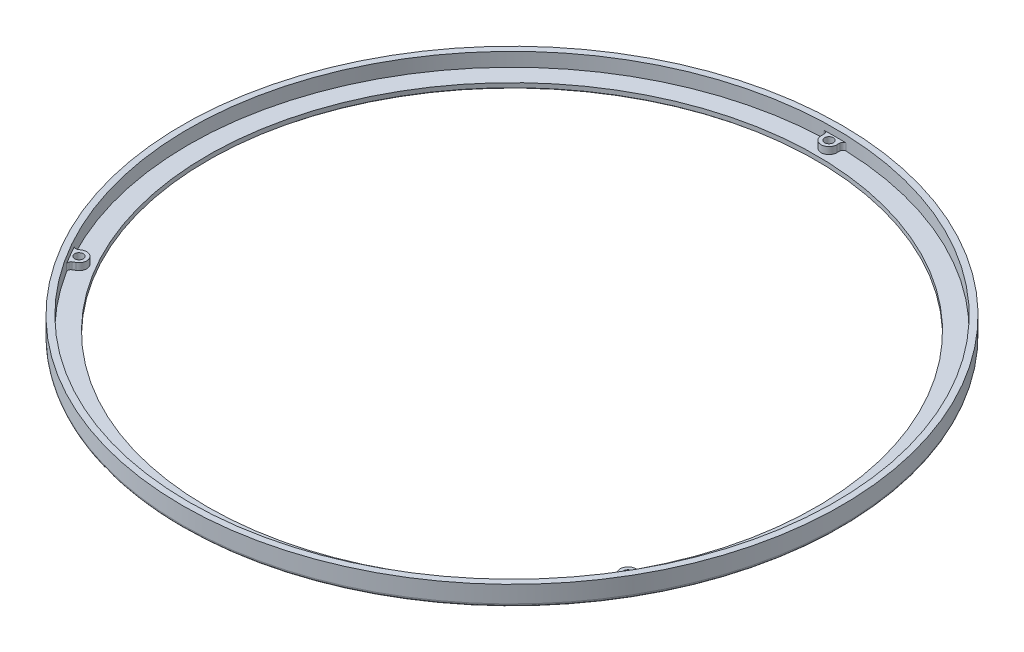
ISO-10303-21;
HEADER;
FILE_DESCRIPTION(('STEP AP214'),'2;1');
FILE_NAME('part.step','',(''),(''),'','','');
FILE_SCHEMA(('AUTOMOTIVE_DESIGN { 1 0 10303 214 1 1 1 1 }'));
ENDSEC;
DATA;
#1=APPLICATION_CONTEXT('core data for automotive mechanical design processes');
#2=APPLICATION_PROTOCOL_DEFINITION('international standard','automotive_design',2000,#1);
#3=PRODUCT_CONTEXT('',#1,'mechanical');
#4=PRODUCT('Part','Part','',(#3));
#5=PRODUCT_RELATED_PRODUCT_CATEGORY('part','',(#4));
#6=PRODUCT_DEFINITION_FORMATION('','',#4);
#7=PRODUCT_DEFINITION_CONTEXT('part definition',#1,'design');
#8=PRODUCT_DEFINITION('design','',#6,#7);
#9=PRODUCT_DEFINITION_SHAPE('','',#8);
#10=(LENGTH_UNIT() NAMED_UNIT(*) SI_UNIT(.MILLI.,.METRE.));
#11=(NAMED_UNIT(*) PLANE_ANGLE_UNIT() SI_UNIT($,.RADIAN.));
#12=(NAMED_UNIT(*) SI_UNIT($,.STERADIAN.) SOLID_ANGLE_UNIT());
#13=UNCERTAINTY_MEASURE_WITH_UNIT(LENGTH_MEASURE(1.E-05),#10,'distance_accuracy_value','');
#14=(GEOMETRIC_REPRESENTATION_CONTEXT(3) GLOBAL_UNCERTAINTY_ASSIGNED_CONTEXT((#13)) GLOBAL_UNIT_ASSIGNED_CONTEXT((#10,
#11,#12)) REPRESENTATION_CONTEXT('',''));
#15=CARTESIAN_POINT('',(0.,0.,0.));
#16=DIRECTION('',(0.,0.,1.));
#17=DIRECTION('',(1.,0.,0.));
#18=AXIS2_PLACEMENT_3D('',#15,#16,#17);
#19=CARTESIAN_POINT('',(-43.734282891114,0.,25.2500000000002));
#20=DIRECTION('',(0.,1.,0.));
#21=DIRECTION('',(0.,0.,1.));
#22=AXIS2_PLACEMENT_3D('',#19,#20,#21);
#23=CYLINDRICAL_SURFACE('',#22,0.700000000000001);
#24=CARTESIAN_POINT('',(-43.734282891114,2.1,25.2500000000002));
#25=DIRECTION('',(0.,1.,0.));
#26=DIRECTION('',(0.,0.,1.));
#27=AXIS2_PLACEMENT_3D('',#24,#25,#26);
#28=CIRCLE('',#27,0.700000000000001);
#29=CARTESIAN_POINT('',(-43.734282891114,2.1,25.9500000000002));
#30=VERTEX_POINT('',#29);
#31=EDGE_CURVE('E273',#30,#30,#28,.T.);
#32=ORIENTED_EDGE('',*,*,#31,.T.);
#33=EDGE_LOOP('',(#32));
#34=FACE_BOUND('',#33,.T.);
#35=CARTESIAN_POINT('',(-43.734282891114,0.7,25.2500000000002));
#36=DIRECTION('',(0.,-1.,0.));
#37=DIRECTION('',(0.,0.,-1.));
#38=AXIS2_PLACEMENT_3D('',#35,#36,#37);
#39=CIRCLE('',#38,0.700000000000001);
#40=CARTESIAN_POINT('',(-43.734282891114,0.7,24.5500000000002));
#41=VERTEX_POINT('',#40);
#42=EDGE_CURVE('E277',#41,#41,#39,.F.);
#43=ORIENTED_EDGE('',*,*,#42,.F.);
#44=EDGE_LOOP('',(#43));
#45=FACE_BOUND('',#44,.T.);
#46=ADVANCED_FACE('F72',(#34,#45),#23,.F.);
#47=CARTESIAN_POINT('',(43.734282891114,0.,25.2500000000002));
#48=DIRECTION('',(0.,1.,0.));
#49=DIRECTION('',(0.,0.,1.));
#50=AXIS2_PLACEMENT_3D('',#47,#48,#49);
#51=CYLINDRICAL_SURFACE('',#50,0.700000000000001);
#52=CARTESIAN_POINT('',(43.734282891114,2.1,25.2500000000002));
#53=DIRECTION('',(0.,1.,0.));
#54=DIRECTION('',(0.,0.,1.));
#55=AXIS2_PLACEMENT_3D('',#52,#53,#54);
#56=CIRCLE('',#55,0.700000000000001);
#57=CARTESIAN_POINT('',(43.734282891114,2.1,25.9500000000002));
#58=VERTEX_POINT('',#57);
#59=EDGE_CURVE('E276',#58,#58,#56,.T.);
#60=ORIENTED_EDGE('',*,*,#59,.T.);
#61=EDGE_LOOP('',(#60));
#62=FACE_BOUND('',#61,.T.);
#63=CARTESIAN_POINT('',(43.734282891114,0.7,25.2500000000002));
#64=DIRECTION('',(0.,-1.,0.));
#65=DIRECTION('',(0.,0.,-1.));
#66=AXIS2_PLACEMENT_3D('',#63,#64,#65);
#67=CIRCLE('',#66,0.700000000000001);
#68=CARTESIAN_POINT('',(43.734282891114,0.7,24.5500000000002));
#69=VERTEX_POINT('',#68);
#70=EDGE_CURVE('E287',#69,#69,#67,.F.);
#71=ORIENTED_EDGE('',*,*,#70,.F.);
#72=EDGE_LOOP('',(#71));
#73=FACE_BOUND('',#72,.T.);
#74=ADVANCED_FACE('F372',(#62,#73),#51,.F.);
#75=CARTESIAN_POINT('',(0.,0.,-50.5));
#76=DIRECTION('',(0.,1.,0.));
#77=DIRECTION('',(0.,0.,1.));
#78=AXIS2_PLACEMENT_3D('',#75,#76,#77);
#79=CYLINDRICAL_SURFACE('',#78,0.7);
#80=CARTESIAN_POINT('',(0.,2.1,-50.5));
#81=DIRECTION('',(0.,1.,0.));
#82=DIRECTION('',(0.,0.,1.));
#83=AXIS2_PLACEMENT_3D('',#80,#81,#82);
#84=CIRCLE('',#83,0.7);
#85=CARTESIAN_POINT('',(0.,2.1,-49.8));
#86=VERTEX_POINT('',#85);
#87=EDGE_CURVE('E280',#86,#86,#84,.T.);
#88=ORIENTED_EDGE('',*,*,#87,.T.);
#89=EDGE_LOOP('',(#88));
#90=FACE_BOUND('',#89,.T.);
#91=CARTESIAN_POINT('',(0.,0.7,-50.5));
#92=DIRECTION('',(0.,-1.,0.));
#93=DIRECTION('',(0.,0.,-1.));
#94=AXIS2_PLACEMENT_3D('',#91,#92,#93);
#95=CIRCLE('',#94,0.7);
#96=CARTESIAN_POINT('',(0.,0.7,-51.2));
#97=VERTEX_POINT('',#96);
#98=EDGE_CURVE('E284',#97,#97,#95,.F.);
#99=ORIENTED_EDGE('',*,*,#98,.F.);
#100=EDGE_LOOP('',(#99));
#101=FACE_BOUND('',#100,.T.);
#102=ADVANCED_FACE('F379',(#90,#101),#79,.F.);
#103=CARTESIAN_POINT('',(0.,1.,0.));
#104=DIRECTION('',(0.,1.,0.));
#105=DIRECTION('',(0.,0.,1.));
#106=AXIS2_PLACEMENT_3D('',#103,#104,#105);
#107=CYLINDRICAL_SURFACE('',#106,51.5);
#108=CARTESIAN_POINT('',(0.,3.2,0.));
#109=DIRECTION('',(0.,1.,0.));
#110=DIRECTION('',(0.,0.,1.));
#111=AXIS2_PLACEMENT_3D('',#108,#109,#110);
#112=CIRCLE('',#111,51.5);
#113=CARTESIAN_POINT('',(0.,3.2,51.5));
#114=VERTEX_POINT('',#113);
#115=EDGE_CURVE('E234',#114,#114,#112,.T.);
#116=ORIENTED_EDGE('',*,*,#115,.T.);
#117=EDGE_LOOP('',(#116));
#118=FACE_BOUND('',#117,.T.);
#119=CARTESIAN_POINT('',(0.,1.,0.));
#120=DIRECTION('',(0.,1.,0.));
#121=DIRECTION('',(0.,0.,1.));
#122=AXIS2_PLACEMENT_3D('',#119,#120,#121);
#123=CIRCLE('',#122,51.5);
#124=CARTESIAN_POINT('',(45.4576220831082,1.,24.2044333655905));
#125=VERTEX_POINT('',#124);
#126=CARTESIAN_POINT('',(1.7671568627451,1.,-51.4696722023995));
#127=VERTEX_POINT('',#126);
#128=EDGE_CURVE('E251',#125,#127,#123,.T.);
#129=ORIENTED_EDGE('',*,*,#128,.F.);
#130=DIRECTION('',(0.,1.,0.));
#131=VECTOR('',#130,1.);
#132=CARTESIAN_POINT('',(45.4576220831082,1.,24.2044333655906));
#133=LINE('',#132,#131);
#134=CARTESIAN_POINT('',(45.4576220831082,2.1,24.2044333655905));
#135=VERTEX_POINT('',#134);
#136=EDGE_CURVE('E316',#125,#135,#133,.T.);
#137=ORIENTED_EDGE('',*,*,#136,.T.);
#138=CARTESIAN_POINT('',(0.,2.1,0.));
#139=DIRECTION('',(0.,1.,0.));
#140=DIRECTION('',(0.,0.,1.));
#141=AXIS2_PLACEMENT_3D('',#138,#139,#140);
#142=CIRCLE('',#141,51.5);
#143=CARTESIAN_POINT('',(43.6904652203631,2.1,27.2652388368091));
#144=VERTEX_POINT('',#143);
#145=EDGE_CURVE('E268',#135,#144,#142,.F.);
#146=ORIENTED_EDGE('',*,*,#145,.T.);
#147=DIRECTION('',(0.,1.,0.));
#148=VECTOR('',#147,1.);
#149=CARTESIAN_POINT('',(43.6904652203631,1.,27.2652388368091));
#150=LINE('',#149,#148);
#151=CARTESIAN_POINT('',(43.6904652203631,1.,27.2652388368091));
#152=VERTEX_POINT('',#151);
#153=EDGE_CURVE('E313',#144,#152,#150,.F.);
#154=ORIENTED_EDGE('',*,*,#153,.T.);
#155=CARTESIAN_POINT('',(-43.6904652203631,1.,27.2652388368091));
#156=VERTEX_POINT('',#155);
#157=EDGE_CURVE('E238',#156,#152,#123,.T.);
#158=ORIENTED_EDGE('',*,*,#157,.F.);
#159=DIRECTION('',(0.,1.,0.));
#160=VECTOR('',#159,1.);
#161=CARTESIAN_POINT('',(-43.6904652203631,1.,27.2652388368092));
#162=LINE('',#161,#160);
#163=CARTESIAN_POINT('',(-43.6904652203631,2.1,27.2652388368091));
#164=VERTEX_POINT('',#163);
#165=EDGE_CURVE('E308',#156,#164,#162,.T.);
#166=ORIENTED_EDGE('',*,*,#165,.T.);
#167=CARTESIAN_POINT('',(0.,2.1,0.));
#168=DIRECTION('',(0.,1.,0.));
#169=DIRECTION('',(0.,0.,1.));
#170=AXIS2_PLACEMENT_3D('',#167,#168,#169);
#171=CIRCLE('',#170,51.5);
#172=CARTESIAN_POINT('',(-45.4576220831082,2.1,24.2044333655906));
#173=VERTEX_POINT('',#172);
#174=EDGE_CURVE('E270',#164,#173,#171,.F.);
#175=ORIENTED_EDGE('',*,*,#174,.T.);
#176=DIRECTION('',(0.,1.,0.));
#177=VECTOR('',#176,1.);
#178=CARTESIAN_POINT('',(-45.4576220831082,1.,24.2044333655906));
#179=LINE('',#178,#177);
#180=CARTESIAN_POINT('',(-45.4576220831082,1.,24.2044333655906));
#181=VERTEX_POINT('',#180);
#182=EDGE_CURVE('E311',#173,#181,#179,.F.);
#183=ORIENTED_EDGE('',*,*,#182,.T.);
#184=CARTESIAN_POINT('',(-1.7671568627451,1.,-51.4696722023995));
#185=VERTEX_POINT('',#184);
#186=EDGE_CURVE('E250',#185,#181,#123,.T.);
#187=ORIENTED_EDGE('',*,*,#186,.F.);
#188=DIRECTION('',(0.,1.,0.));
#189=VECTOR('',#188,1.);
#190=CARTESIAN_POINT('',(-1.7671568627451,1.,-51.4696722023995));
#191=LINE('',#190,#189);
#192=CARTESIAN_POINT('',(-1.7671568627451,2.1,-51.4696722023995));
#193=VERTEX_POINT('',#192);
#194=EDGE_CURVE('E305',#185,#193,#191,.T.);
#195=ORIENTED_EDGE('',*,*,#194,.T.);
#196=CARTESIAN_POINT('',(0.,2.1,0.));
#197=DIRECTION('',(0.,1.,0.));
#198=DIRECTION('',(0.,0.,1.));
#199=AXIS2_PLACEMENT_3D('',#196,#197,#198);
#200=CIRCLE('',#199,51.5);
#201=CARTESIAN_POINT('',(1.7671568627451,2.1,-51.4696722023995));
#202=VERTEX_POINT('',#201);
#203=EDGE_CURVE('E266',#193,#202,#200,.F.);
#204=ORIENTED_EDGE('',*,*,#203,.T.);
#205=DIRECTION('',(0.,1.,0.));
#206=VECTOR('',#205,1.);
#207=CARTESIAN_POINT('',(1.7671568627451,1.,-51.4696722023995));
#208=LINE('',#207,#206);
#209=EDGE_CURVE('E302',#202,#127,#208,.F.);
#210=ORIENTED_EDGE('',*,*,#209,.T.);
#211=EDGE_LOOP('',(#129,#137,#146,#154,#158,#166,#175,#183,#187,#195,#204,#210));
#212=FACE_BOUND('',#211,.T.);
#213=ADVANCED_FACE('F433',(#118,#212),#107,.F.);
#214=CARTESIAN_POINT('',(0.,1.,0.));
#215=DIRECTION('',(0.,1.,0.));
#216=DIRECTION('',(0.,0.,1.));
#217=AXIS2_PLACEMENT_3D('',#214,#215,#216);
#218=PLANE('',#217);
#219=CARTESIAN_POINT('',(0.,1.,0.));
#220=DIRECTION('',(0.,1.,0.));
#221=DIRECTION('',(0.,0.,1.));
#222=AXIS2_PLACEMENT_3D('',#219,#220,#221);
#223=CIRCLE('',#222,48.5);
#224=CARTESIAN_POINT('',(0.,1.,48.5));
#225=VERTEX_POINT('',#224);
#226=EDGE_CURVE('E257',#225,#225,#223,.T.);
#227=ORIENTED_EDGE('',*,*,#226,.F.);
#228=EDGE_LOOP('',(#227));
#229=FACE_BOUND('',#228,.T.);
#230=DIRECTION('',(0.866025403784438,0.,0.500000000000002));
#231=VECTOR('',#230,1.);
#232=CARTESIAN_POINT('',(44.359282891114,1.,24.1674682452695));
#233=LINE('',#232,#231);
#234=CARTESIAN_POINT('',(44.359282891114,1.,24.1674682452696));
#235=VERTEX_POINT('',#234);
#236=CARTESIAN_POINT('',(44.766285946379,1.,24.4024515687877));
#237=VERTEX_POINT('',#236);
#238=EDGE_CURVE('E503',#235,#237,#233,.T.);
#239=ORIENTED_EDGE('',*,*,#238,.T.);
#240=CARTESIAN_POINT('',(45.016285946379,1.,23.9694388668955));
#241=DIRECTION('',(0.,1.,0.));
#242=DIRECTION('',(0.,0.,1.));
#243=AXIS2_PLACEMENT_3D('',#240,#241,#242);
#244=CIRCLE('',#243,0.5);
#245=EDGE_CURVE('E331',#237,#125,#244,.T.);
#246=ORIENTED_EDGE('',*,*,#245,.T.);
#247=ORIENTED_EDGE('',*,*,#128,.T.);
#248=CARTESIAN_POINT('',(1.75,1.,-50.9699666470364));
#249=DIRECTION('',(0.,1.,0.));
#250=DIRECTION('',(0.,0.,1.));
#251=AXIS2_PLACEMENT_3D('',#248,#249,#250);
#252=CIRCLE('',#251,0.5);
#253=CARTESIAN_POINT('',(1.25,1.,-50.9699666470364));
#254=VERTEX_POINT('',#253);
#255=EDGE_CURVE('E321',#127,#254,#252,.T.);
#256=ORIENTED_EDGE('',*,*,#255,.T.);
#257=DIRECTION('',(0.,0.,1.));
#258=VECTOR('',#257,1.);
#259=CARTESIAN_POINT('',(1.25,1.,-51.5));
#260=LINE('',#259,#258);
#261=CARTESIAN_POINT('',(1.25,1.,-50.5));
#262=VERTEX_POINT('',#261);
#263=EDGE_CURVE('E486',#254,#262,#260,.T.);
#264=ORIENTED_EDGE('',*,*,#263,.T.);
#265=CARTESIAN_POINT('',(0.,1.,-50.5));
#266=DIRECTION('',(0.,1.,0.));
#267=DIRECTION('',(0.,0.,1.));
#268=AXIS2_PLACEMENT_3D('',#265,#266,#267);
#269=CIRCLE('',#268,1.25);
#270=CARTESIAN_POINT('',(-1.25,1.,-50.5));
#271=VERTEX_POINT('',#270);
#272=EDGE_CURVE('E256',#262,#271,#269,.F.);
#273=ORIENTED_EDGE('',*,*,#272,.T.);
#274=DIRECTION('',(0.,0.,1.));
#275=VECTOR('',#274,1.);
#276=CARTESIAN_POINT('',(-1.25,1.,-51.5));
#277=LINE('',#276,#275);
#278=CARTESIAN_POINT('',(-1.25,1.,-50.9699666470364));
#279=VERTEX_POINT('',#278);
#280=EDGE_CURVE('E478',#279,#271,#277,.T.);
#281=ORIENTED_EDGE('',*,*,#280,.F.);
#282=CARTESIAN_POINT('',(-1.75,1.,-50.9699666470364));
#283=DIRECTION('',(0.,1.,0.));
#284=DIRECTION('',(0.,0.,1.));
#285=AXIS2_PLACEMENT_3D('',#282,#283,#284);
#286=CIRCLE('',#285,0.5);
#287=EDGE_CURVE('E323',#279,#185,#286,.T.);
#288=ORIENTED_EDGE('',*,*,#287,.T.);
#289=ORIENTED_EDGE('',*,*,#186,.T.);
#290=CARTESIAN_POINT('',(-45.016285946379,1.,23.9694388668956));
#291=DIRECTION('',(0.,1.,0.));
#292=DIRECTION('',(0.,0.,1.));
#293=AXIS2_PLACEMENT_3D('',#290,#291,#292);
#294=CIRCLE('',#293,0.5);
#295=CARTESIAN_POINT('',(-44.766285946379,1.,24.4024515687878));
#296=VERTEX_POINT('',#295);
#297=EDGE_CURVE('E327',#181,#296,#294,.T.);
#298=ORIENTED_EDGE('',*,*,#297,.T.);
#299=DIRECTION('',(-0.866025403784438,0.,0.500000000000002));
#300=VECTOR('',#299,1.);
#301=CARTESIAN_POINT('',(-44.3592828911141,1.,24.1674682452696));
#302=LINE('',#301,#300);
#303=CARTESIAN_POINT('',(-44.3592828911141,1.,24.1674682452696));
#304=VERTEX_POINT('',#303);
#305=EDGE_CURVE('E532',#304,#296,#302,.T.);
#306=ORIENTED_EDGE('',*,*,#305,.F.);
#307=CARTESIAN_POINT('',(-43.734282891114,1.,25.2500000000002));
#308=DIRECTION('',(0.,1.,0.));
#309=DIRECTION('',(0.,0.,1.));
#310=AXIS2_PLACEMENT_3D('',#307,#308,#309);
#311=CIRCLE('',#310,1.25);
#312=CARTESIAN_POINT('',(-43.1092828911141,1.,26.3325317547307));
#313=VERTEX_POINT('',#312);
#314=EDGE_CURVE('E228',#304,#313,#311,.F.);
#315=ORIENTED_EDGE('',*,*,#314,.T.);
#316=DIRECTION('',(0.866025403784439,0.,-0.499999999999998));
#317=VECTOR('',#316,1.);
#318=CARTESIAN_POINT('',(-43.9753082948985,1.,26.8325317547307));
#319=LINE('',#318,#317);
#320=CARTESIAN_POINT('',(-43.516285946379,1.,26.5675150782489));
#321=VERTEX_POINT('',#320);
#322=EDGE_CURVE('E489',#321,#313,#319,.T.);
#323=ORIENTED_EDGE('',*,*,#322,.F.);
#324=CARTESIAN_POINT('',(-43.266285946379,1.,27.0005277801411));
#325=DIRECTION('',(0.,1.,0.));
#326=DIRECTION('',(0.,0.,1.));
#327=AXIS2_PLACEMENT_3D('',#324,#325,#326);
#328=CIRCLE('',#327,0.5);
#329=EDGE_CURVE('E325',#321,#156,#328,.T.);
#330=ORIENTED_EDGE('',*,*,#329,.T.);
#331=ORIENTED_EDGE('',*,*,#157,.T.);
#332=CARTESIAN_POINT('',(43.266285946379,1.,27.000527780141));
#333=DIRECTION('',(0.,1.,0.));
#334=DIRECTION('',(0.,0.,1.));
#335=AXIS2_PLACEMENT_3D('',#332,#333,#334);
#336=CIRCLE('',#335,0.5);
#337=CARTESIAN_POINT('',(43.516285946379,1.,26.5675150782488));
#338=VERTEX_POINT('',#337);
#339=EDGE_CURVE('E329',#152,#338,#336,.T.);
#340=ORIENTED_EDGE('',*,*,#339,.T.);
#341=DIRECTION('',(-0.866025403784438,0.,-0.500000000000002));
#342=VECTOR('',#341,1.);
#343=CARTESIAN_POINT('',(43.9753082948985,1.,26.8325317547306));
#344=LINE('',#343,#342);
#345=CARTESIAN_POINT('',(43.109282891114,1.,26.3325317547306));
#346=VERTEX_POINT('',#345);
#347=EDGE_CURVE('E505',#338,#346,#344,.T.);
#348=ORIENTED_EDGE('',*,*,#347,.T.);
#349=CARTESIAN_POINT('',(43.734282891114,1.,25.2500000000002));
#350=DIRECTION('',(0.,1.,0.));
#351=DIRECTION('',(0.,0.,1.));
#352=AXIS2_PLACEMENT_3D('',#349,#350,#351);
#353=CIRCLE('',#352,1.25);
#354=EDGE_CURVE('E262',#346,#235,#353,.F.);
#355=ORIENTED_EDGE('',*,*,#354,.T.);
#356=EDGE_LOOP('',(#239,#246,#247,#256,#264,#273,#281,#288,#289,#298,#306,#315,#323,#330,#331,
#340,#348,#355));
#357=FACE_BOUND('',#356,.T.);
#358=ADVANCED_FACE('F425',(#229,#357),#218,.T.);
#359=CARTESIAN_POINT('',(0.,2.1,-50.5));
#360=DIRECTION('',(0.,-1.,0.));
#361=DIRECTION('',(0.,0.,-1.));
#362=AXIS2_PLACEMENT_3D('',#359,#360,#361);
#363=CYLINDRICAL_SURFACE('',#362,1.25);
#364=DIRECTION('',(0.,-1.,0.));
#365=VECTOR('',#364,1.);
#366=CARTESIAN_POINT('',(1.25,2.1,-50.5));
#367=LINE('',#366,#365);
#368=CARTESIAN_POINT('',(1.25,2.1,-50.5));
#369=VERTEX_POINT('',#368);
#370=EDGE_CURVE('E506',#369,#262,#367,.T.);
#371=ORIENTED_EDGE('',*,*,#370,.F.);
#372=CARTESIAN_POINT('',(0.,2.1,-50.5));
#373=DIRECTION('',(0.,1.,0.));
#374=DIRECTION('',(0.,0.,1.));
#375=AXIS2_PLACEMENT_3D('',#372,#373,#374);
#376=CIRCLE('',#375,1.25);
#377=CARTESIAN_POINT('',(-1.25,2.1,-50.5));
#378=VERTEX_POINT('',#377);
#379=EDGE_CURVE('E241',#378,#369,#376,.T.);
#380=ORIENTED_EDGE('',*,*,#379,.F.);
#381=DIRECTION('',(0.,-1.,0.));
#382=VECTOR('',#381,1.);
#383=CARTESIAN_POINT('',(-1.25,2.1,-50.5));
#384=LINE('',#383,#382);
#385=EDGE_CURVE('E493',#378,#271,#384,.T.);
#386=ORIENTED_EDGE('',*,*,#385,.T.);
#387=ORIENTED_EDGE('',*,*,#272,.F.);
#388=EDGE_LOOP('',(#371,#380,#386,#387));
#389=FACE_BOUND('',#388,.T.);
#390=ADVANCED_FACE('F417',(#389),#363,.T.);
#391=CARTESIAN_POINT('',(43.734282891114,2.1,25.2500000000002));
#392=DIRECTION('',(0.,-1.,0.));
#393=DIRECTION('',(0.,0.,-1.));
#394=AXIS2_PLACEMENT_3D('',#391,#392,#393);
#395=CYLINDRICAL_SURFACE('',#394,1.25);
#396=CARTESIAN_POINT('',(43.734282891114,2.1,25.2500000000002));
#397=DIRECTION('',(0.,1.,0.));
#398=DIRECTION('',(0.,0.,1.));
#399=AXIS2_PLACEMENT_3D('',#396,#397,#398);
#400=CIRCLE('',#399,1.25);
#401=CARTESIAN_POINT('',(44.359282891114,2.1,24.1674682452695));
#402=VERTEX_POINT('',#401);
#403=CARTESIAN_POINT('',(43.109282891114,2.1,26.3325317547308));
#404=VERTEX_POINT('',#403);
#405=EDGE_CURVE('E235',#402,#404,#400,.T.);
#406=ORIENTED_EDGE('',*,*,#405,.F.);
#407=DIRECTION('',(0.,-1.,0.));
#408=VECTOR('',#407,1.);
#409=CARTESIAN_POINT('',(44.359282891114,2.1,24.1674682452695));
#410=LINE('',#409,#408);
#411=EDGE_CURVE('E283',#402,#235,#410,.T.);
#412=ORIENTED_EDGE('',*,*,#411,.T.);
#413=ORIENTED_EDGE('',*,*,#354,.F.);
#414=DIRECTION('',(0.,-1.,0.));
#415=VECTOR('',#414,1.);
#416=CARTESIAN_POINT('',(43.109282891114,2.1,26.3325317547306));
#417=LINE('',#416,#415);
#418=EDGE_CURVE('E497',#404,#346,#417,.T.);
#419=ORIENTED_EDGE('',*,*,#418,.F.);
#420=EDGE_LOOP('',(#406,#412,#413,#419));
#421=FACE_BOUND('',#420,.T.);
#422=ADVANCED_FACE('F414',(#421),#395,.T.);
#423=CARTESIAN_POINT('',(-43.734282891114,2.1,25.2500000000002));
#424=DIRECTION('',(0.,-1.,0.));
#425=DIRECTION('',(0.,0.,-1.));
#426=AXIS2_PLACEMENT_3D('',#423,#424,#425);
#427=CYLINDRICAL_SURFACE('',#426,1.25);
#428=DIRECTION('',(0.,-1.,0.));
#429=VECTOR('',#428,1.);
#430=CARTESIAN_POINT('',(-43.1092828911141,2.1,26.3325317547307));
#431=LINE('',#430,#429);
#432=CARTESIAN_POINT('',(-43.109282891114,2.1,26.3325317547308));
#433=VERTEX_POINT('',#432);
#434=EDGE_CURVE('E229',#433,#313,#431,.T.);
#435=ORIENTED_EDGE('',*,*,#434,.T.);
#436=ORIENTED_EDGE('',*,*,#314,.F.);
#437=DIRECTION('',(0.,-1.,0.));
#438=VECTOR('',#437,1.);
#439=CARTESIAN_POINT('',(-44.3592828911141,2.1,24.1674682452696));
#440=LINE('',#439,#438);
#441=CARTESIAN_POINT('',(-44.3592828911141,2.1,24.1674682452696));
#442=VERTEX_POINT('',#441);
#443=EDGE_CURVE('E212',#442,#304,#440,.T.);
#444=ORIENTED_EDGE('',*,*,#443,.F.);
#445=CARTESIAN_POINT('',(-43.734282891114,2.1,25.2500000000002));
#446=DIRECTION('',(0.,1.,0.));
#447=DIRECTION('',(0.,0.,1.));
#448=AXIS2_PLACEMENT_3D('',#445,#446,#447);
#449=CIRCLE('',#448,1.25);
#450=EDGE_CURVE('E226',#433,#442,#449,.T.);
#451=ORIENTED_EDGE('',*,*,#450,.F.);
#452=EDGE_LOOP('',(#435,#436,#444,#451));
#453=FACE_BOUND('',#452,.T.);
#454=ADVANCED_FACE('F225',(#453),#427,.T.);
#455=CARTESIAN_POINT('',(0.,3.2,0.));
#456=DIRECTION('',(0.,-1.,0.));
#457=DIRECTION('',(0.,0.,-1.));
#458=AXIS2_PLACEMENT_3D('',#455,#456,#457);
#459=CYLINDRICAL_SURFACE('',#458,48.5);
#460=CARTESIAN_POINT('',(0.,0.299999999999995,0.));
#461=DIRECTION('',(0.,1.,0.));
#462=DIRECTION('',(0.,0.,1.));
#463=AXIS2_PLACEMENT_3D('',#460,#461,#462);
#464=CIRCLE('',#463,48.5);
#465=CARTESIAN_POINT('',(0.,0.299999999999995,48.5));
#466=VERTEX_POINT('',#465);
#467=EDGE_CURVE('E12',#466,#466,#464,.F.);
#468=ORIENTED_EDGE('',*,*,#467,.T.);
#469=EDGE_LOOP('',(#468));
#470=FACE_BOUND('',#469,.T.);
#471=ORIENTED_EDGE('',*,*,#226,.T.);
#472=EDGE_LOOP('',(#471));
#473=FACE_BOUND('',#472,.T.);
#474=ADVANCED_FACE('F413',(#470,#473),#459,.F.);
#475=CARTESIAN_POINT('',(0.,3.2,0.));
#476=DIRECTION('',(0.,1.,0.));
#477=DIRECTION('',(0.,0.,1.));
#478=AXIS2_PLACEMENT_3D('',#475,#476,#477);
#479=PLANE('',#478);
#480=ORIENTED_EDGE('',*,*,#115,.F.);
#481=EDGE_LOOP('',(#480));
#482=FACE_BOUND('',#481,.T.);
#483=CARTESIAN_POINT('',(0.,3.2,0.));
#484=DIRECTION('',(0.,1.,0.));
#485=DIRECTION('',(0.,0.,1.));
#486=AXIS2_PLACEMENT_3D('',#483,#484,#485);
#487=CIRCLE('',#486,52.5);
#488=CARTESIAN_POINT('',(0.,3.2,52.5));
#489=VERTEX_POINT('',#488);
#490=EDGE_CURVE('E253',#489,#489,#487,.T.);
#491=ORIENTED_EDGE('',*,*,#490,.T.);
#492=EDGE_LOOP('',(#491));
#493=FACE_BOUND('',#492,.T.);
#494=ADVANCED_FACE('F440',(#482,#493),#479,.T.);
#495=CARTESIAN_POINT('',(0.,0.,0.));
#496=DIRECTION('',(0.,1.,0.));
#497=DIRECTION('',(0.,0.,1.));
#498=AXIS2_PLACEMENT_3D('',#495,#496,#497);
#499=PLANE('',#498);
#500=CARTESIAN_POINT('',(0.,0.,0.));
#501=DIRECTION('',(0.,1.,0.));
#502=DIRECTION('',(0.,0.,1.));
#503=AXIS2_PLACEMENT_3D('',#500,#501,#502);
#504=CIRCLE('',#503,48.8575260777783);
#505=CARTESIAN_POINT('',(0.,0.,48.8575260777783));
#506=VERTEX_POINT('',#505);
#507=EDGE_CURVE('E81',#506,#506,#504,.T.);
#508=ORIENTED_EDGE('',*,*,#507,.T.);
#509=EDGE_LOOP('',(#508));
#510=FACE_BOUND('',#509,.T.);
#511=CARTESIAN_POINT('',(-43.734282891114,0.,25.2500000000002));
#512=DIRECTION('',(0.,-1.,0.));
#513=DIRECTION('',(0.,0.,-1.));
#514=AXIS2_PLACEMENT_3D('',#511,#512,#513);
#515=CIRCLE('',#514,1.5);
#516=CARTESIAN_POINT('',(-45.0333209967907,0.,26.0000000000002));
#517=VERTEX_POINT('',#516);
#518=EDGE_CURVE('E554',#517,#517,#515,.T.);
#519=ORIENTED_EDGE('',*,*,#518,.F.);
#520=CARTESIAN_POINT('',(0.,0.,0.));
#521=DIRECTION('',(0.,1.,0.));
#522=DIRECTION('',(0.,0.,1.));
#523=AXIS2_PLACEMENT_3D('',#520,#521,#522);
#524=CIRCLE('',#523,52.);
#525=CARTESIAN_POINT('',(0.,0.,-52.));
#526=VERTEX_POINT('',#525);
#527=EDGE_CURVE('E299',#517,#526,#524,.F.);
#528=ORIENTED_EDGE('',*,*,#527,.T.);
#529=CARTESIAN_POINT('',(0.,0.,-50.5));
#530=DIRECTION('',(0.,-1.,0.));
#531=DIRECTION('',(0.,0.,-1.));
#532=AXIS2_PLACEMENT_3D('',#529,#530,#531);
#533=CIRCLE('',#532,1.5);
#534=EDGE_CURVE('E551',#526,#526,#533,.T.);
#535=ORIENTED_EDGE('',*,*,#534,.F.);
#536=CARTESIAN_POINT('',(0.,0.,0.));
#537=DIRECTION('',(0.,1.,0.));
#538=DIRECTION('',(0.,0.,1.));
#539=AXIS2_PLACEMENT_3D('',#536,#537,#538);
#540=CIRCLE('',#539,52.);
#541=CARTESIAN_POINT('',(45.0333209967907,0.,26.0000000000002));
#542=VERTEX_POINT('',#541);
#543=EDGE_CURVE('E297',#526,#542,#540,.F.);
#544=ORIENTED_EDGE('',*,*,#543,.T.);
#545=CARTESIAN_POINT('',(43.734282891114,0.,25.2500000000002));
#546=DIRECTION('',(0.,-1.,0.));
#547=DIRECTION('',(0.,0.,-1.));
#548=AXIS2_PLACEMENT_3D('',#545,#546,#547);
#549=CIRCLE('',#548,1.5);
#550=EDGE_CURVE('E545',#542,#542,#549,.T.);
#551=ORIENTED_EDGE('',*,*,#550,.F.);
#552=CARTESIAN_POINT('',(0.,0.,0.));
#553=DIRECTION('',(0.,1.,0.));
#554=DIRECTION('',(0.,0.,1.));
#555=AXIS2_PLACEMENT_3D('',#552,#553,#554);
#556=CIRCLE('',#555,52.);
#557=EDGE_CURVE('E295',#542,#517,#556,.F.);
#558=ORIENTED_EDGE('',*,*,#557,.T.);
#559=EDGE_LOOP('',(#519,#528,#535,#544,#551,#558));
#560=FACE_BOUND('',#559,.T.);
#561=ADVANCED_FACE('F358',(#510,#560),#499,.F.);
#562=CARTESIAN_POINT('',(0.,3.2,0.));
#563=DIRECTION('',(0.,-1.,0.));
#564=DIRECTION('',(0.,0.,-1.));
#565=AXIS2_PLACEMENT_3D('',#562,#563,#564);
#566=CYLINDRICAL_SURFACE('',#565,52.5);
#567=CARTESIAN_POINT('',(0.,0.5,0.));
#568=DIRECTION('',(0.,1.,0.));
#569=DIRECTION('',(0.,0.,1.));
#570=AXIS2_PLACEMENT_3D('',#567,#568,#569);
#571=CIRCLE('',#570,52.5);
#572=CARTESIAN_POINT('',(0.,0.5,52.5));
#573=VERTEX_POINT('',#572);
#574=EDGE_CURVE('E272',#573,#573,#571,.T.);
#575=ORIENTED_EDGE('',*,*,#574,.T.);
#576=EDGE_LOOP('',(#575));
#577=FACE_BOUND('',#576,.T.);
#578=ORIENTED_EDGE('',*,*,#490,.F.);
#579=EDGE_LOOP('',(#578));
#580=FACE_BOUND('',#579,.T.);
#581=ADVANCED_FACE('F429',(#577,#580),#566,.T.);
#582=CARTESIAN_POINT('',(0.,2.1,-50.5));
#583=DIRECTION('',(0.,1.,0.));
#584=DIRECTION('',(0.,0.,1.));
#585=AXIS2_PLACEMENT_3D('',#582,#583,#584);
#586=PLANE('',#585);
#587=ORIENTED_EDGE('',*,*,#87,.F.);
#588=EDGE_LOOP('',(#587));
#589=FACE_BOUND('',#588,.T.);
#590=ORIENTED_EDGE('',*,*,#203,.F.);
#591=CARTESIAN_POINT('',(-1.75,2.1,-50.9699666470364));
#592=DIRECTION('',(0.,1.,0.));
#593=DIRECTION('',(0.,0.,1.));
#594=AXIS2_PLACEMENT_3D('',#591,#592,#593);
#595=CIRCLE('',#594,0.5);
#596=CARTESIAN_POINT('',(-1.25,2.1,-50.9699666470364));
#597=VERTEX_POINT('',#596);
#598=EDGE_CURVE('E96',#193,#597,#595,.F.);
#599=ORIENTED_EDGE('',*,*,#598,.T.);
#600=DIRECTION('',(0.,0.,1.));
#601=VECTOR('',#600,1.);
#602=CARTESIAN_POINT('',(-1.25,2.1,-51.5));
#603=LINE('',#602,#601);
#604=EDGE_CURVE('E480',#597,#378,#603,.T.);
#605=ORIENTED_EDGE('',*,*,#604,.T.);
#606=ORIENTED_EDGE('',*,*,#379,.T.);
#607=DIRECTION('',(0.,0.,1.));
#608=VECTOR('',#607,1.);
#609=CARTESIAN_POINT('',(1.25,2.1,-51.5));
#610=LINE('',#609,#608);
#611=CARTESIAN_POINT('',(1.25,2.1,-50.9699666470364));
#612=VERTEX_POINT('',#611);
#613=EDGE_CURVE('E487',#612,#369,#610,.T.);
#614=ORIENTED_EDGE('',*,*,#613,.F.);
#615=CARTESIAN_POINT('',(1.75,2.1,-50.9699666470364));
#616=DIRECTION('',(0.,1.,0.));
#617=DIRECTION('',(0.,0.,1.));
#618=AXIS2_PLACEMENT_3D('',#615,#616,#617);
#619=CIRCLE('',#618,0.5);
#620=EDGE_CURVE('E353',#612,#202,#619,.F.);
#621=ORIENTED_EDGE('',*,*,#620,.T.);
#622=EDGE_LOOP('',(#590,#599,#605,#606,#614,#621));
#623=FACE_BOUND('',#622,.T.);
#624=ADVANCED_FACE('F421',(#589,#623),#586,.T.);
#625=CARTESIAN_POINT('',(43.734282891114,2.1,25.2500000000002));
#626=DIRECTION('',(0.,1.,0.));
#627=DIRECTION('',(0.,0.,1.));
#628=AXIS2_PLACEMENT_3D('',#625,#626,#627);
#629=PLANE('',#628);
#630=ORIENTED_EDGE('',*,*,#59,.F.);
#631=EDGE_LOOP('',(#630));
#632=FACE_BOUND('',#631,.T.);
#633=ORIENTED_EDGE('',*,*,#405,.T.);
#634=DIRECTION('',(-0.866025403784438,0.,-0.500000000000002));
#635=VECTOR('',#634,1.);
#636=CARTESIAN_POINT('',(43.9753082948985,2.1,26.8325317547306));
#637=LINE('',#636,#635);
#638=CARTESIAN_POINT('',(43.516285946379,2.1,26.5675150782488));
#639=VERTEX_POINT('',#638);
#640=EDGE_CURVE('E244',#639,#404,#637,.T.);
#641=ORIENTED_EDGE('',*,*,#640,.F.);
#642=CARTESIAN_POINT('',(43.266285946379,2.1,27.000527780141));
#643=DIRECTION('',(0.,1.,0.));
#644=DIRECTION('',(0.,0.,1.));
#645=AXIS2_PLACEMENT_3D('',#642,#643,#644);
#646=CIRCLE('',#645,0.5);
#647=EDGE_CURVE('E345',#639,#144,#646,.F.);
#648=ORIENTED_EDGE('',*,*,#647,.T.);
#649=ORIENTED_EDGE('',*,*,#145,.F.);
#650=CARTESIAN_POINT('',(45.016285946379,2.1,23.9694388668955));
#651=DIRECTION('',(0.,1.,0.));
#652=DIRECTION('',(0.,0.,1.));
#653=AXIS2_PLACEMENT_3D('',#650,#651,#652);
#654=CIRCLE('',#653,0.5);
#655=CARTESIAN_POINT('',(44.766285946379,2.1,24.4024515687877));
#656=VERTEX_POINT('',#655);
#657=EDGE_CURVE('E343',#135,#656,#654,.F.);
#658=ORIENTED_EDGE('',*,*,#657,.T.);
#659=DIRECTION('',(0.866025403784438,0.,0.500000000000002));
#660=VECTOR('',#659,1.);
#661=CARTESIAN_POINT('',(44.359282891114,2.1,24.1674682452695));
#662=LINE('',#661,#660);
#663=EDGE_CURVE('E500',#402,#656,#662,.T.);
#664=ORIENTED_EDGE('',*,*,#663,.F.);
#665=EDGE_LOOP('',(#633,#641,#648,#649,#658,#664));
#666=FACE_BOUND('',#665,.T.);
#667=ADVANCED_FACE('F410',(#632,#666),#629,.T.);
#668=CARTESIAN_POINT('',(-43.734282891114,2.1,25.2500000000002));
#669=DIRECTION('',(0.,1.,0.));
#670=DIRECTION('',(0.,0.,1.));
#671=AXIS2_PLACEMENT_3D('',#668,#669,#670);
#672=PLANE('',#671);
#673=ORIENTED_EDGE('',*,*,#31,.F.);
#674=EDGE_LOOP('',(#673));
#675=FACE_BOUND('',#674,.T.);
#676=ORIENTED_EDGE('',*,*,#174,.F.);
#677=CARTESIAN_POINT('',(-43.266285946379,2.1,27.0005277801411));
#678=DIRECTION('',(0.,1.,0.));
#679=DIRECTION('',(0.,0.,1.));
#680=AXIS2_PLACEMENT_3D('',#677,#678,#679);
#681=CIRCLE('',#680,0.5);
#682=CARTESIAN_POINT('',(-43.516285946379,2.1,26.5675150782489));
#683=VERTEX_POINT('',#682);
#684=EDGE_CURVE('E350',#164,#683,#681,.F.);
#685=ORIENTED_EDGE('',*,*,#684,.T.);
#686=DIRECTION('',(0.866025403784439,0.,-0.499999999999998));
#687=VECTOR('',#686,1.);
#688=CARTESIAN_POINT('',(-43.9753082948985,2.1,26.8325317547307));
#689=LINE('',#688,#687);
#690=EDGE_CURVE('E219',#683,#433,#689,.T.);
#691=ORIENTED_EDGE('',*,*,#690,.T.);
#692=ORIENTED_EDGE('',*,*,#450,.T.);
#693=DIRECTION('',(-0.866025403784438,0.,0.500000000000002));
#694=VECTOR('',#693,1.);
#695=CARTESIAN_POINT('',(-44.3592828911141,2.1,24.1674682452696));
#696=LINE('',#695,#694);
#697=CARTESIAN_POINT('',(-44.766285946379,2.1,24.4024515687878));
#698=VERTEX_POINT('',#697);
#699=EDGE_CURVE('E208',#442,#698,#696,.T.);
#700=ORIENTED_EDGE('',*,*,#699,.T.);
#701=CARTESIAN_POINT('',(-45.016285946379,2.1,23.9694388668956));
#702=DIRECTION('',(0.,1.,0.));
#703=DIRECTION('',(0.,0.,1.));
#704=AXIS2_PLACEMENT_3D('',#701,#702,#703);
#705=CIRCLE('',#704,0.5);
#706=EDGE_CURVE('E348',#698,#173,#705,.F.);
#707=ORIENTED_EDGE('',*,*,#706,.T.);
#708=EDGE_LOOP('',(#676,#685,#691,#692,#700,#707));
#709=FACE_BOUND('',#708,.T.);
#710=ADVANCED_FACE('F231',(#675,#709),#672,.T.);
#711=CARTESIAN_POINT('',(-43.9753082948985,2.1,26.8325317547307));
#712=DIRECTION('',(-0.499999999999999,0.,-0.86602540378444));
#713=DIRECTION('',(-0.86602540378444,0.,0.499999999999999));
#714=AXIS2_PLACEMENT_3D('',#711,#712,#713);
#715=PLANE('',#714);
#716=ORIENTED_EDGE('',*,*,#690,.F.);
#717=DIRECTION('',(0.,-1.,0.));
#718=VECTOR('',#717,1.);
#719=CARTESIAN_POINT('',(-43.516285946379,1.,26.5675150782489));
#720=LINE('',#719,#718);
#721=EDGE_CURVE('E336',#683,#321,#720,.T.);
#722=ORIENTED_EDGE('',*,*,#721,.T.);
#723=ORIENTED_EDGE('',*,*,#322,.T.);
#724=ORIENTED_EDGE('',*,*,#434,.F.);
#725=EDGE_LOOP('',(#716,#722,#723,#724));
#726=FACE_BOUND('',#725,.T.);
#727=ADVANCED_FACE('F389',(#726),#715,.F.);
#728=CARTESIAN_POINT('',(-44.3592828911141,2.1,24.1674682452696));
#729=DIRECTION('',(0.500000000000002,0.,0.866025403784438));
#730=DIRECTION('',(0.866025403784438,0.,-0.500000000000002));
#731=AXIS2_PLACEMENT_3D('',#728,#729,#730);
#732=PLANE('',#731);
#733=ORIENTED_EDGE('',*,*,#305,.T.);
#734=DIRECTION('',(0.,-1.,0.));
#735=VECTOR('',#734,1.);
#736=CARTESIAN_POINT('',(-44.766285946379,2.1,24.4024515687878));
#737=LINE('',#736,#735);
#738=EDGE_CURVE('E215',#296,#698,#737,.F.);
#739=ORIENTED_EDGE('',*,*,#738,.T.);
#740=ORIENTED_EDGE('',*,*,#699,.F.);
#741=ORIENTED_EDGE('',*,*,#443,.T.);
#742=EDGE_LOOP('',(#733,#739,#740,#741));
#743=FACE_BOUND('',#742,.T.);
#744=ADVANCED_FACE('F211',(#743),#732,.F.);
#745=CARTESIAN_POINT('',(43.9753082948985,2.1,26.8325317547306));
#746=DIRECTION('',(-0.500000000000002,0.,0.866025403784438));
#747=DIRECTION('',(0.866025403784438,0.,0.500000000000002));
#748=AXIS2_PLACEMENT_3D('',#745,#746,#747);
#749=PLANE('',#748);
#750=ORIENTED_EDGE('',*,*,#347,.F.);
#751=DIRECTION('',(0.,1.,0.));
#752=VECTOR('',#751,1.);
#753=CARTESIAN_POINT('',(43.516285946379,2.1,26.5675150782488));
#754=LINE('',#753,#752);
#755=EDGE_CURVE('E333',#338,#639,#754,.T.);
#756=ORIENTED_EDGE('',*,*,#755,.T.);
#757=ORIENTED_EDGE('',*,*,#640,.T.);
#758=ORIENTED_EDGE('',*,*,#418,.T.);
#759=EDGE_LOOP('',(#750,#756,#757,#758));
#760=FACE_BOUND('',#759,.T.);
#761=ADVANCED_FACE('F388',(#760),#749,.T.);
#762=CARTESIAN_POINT('',(0.625000000000001,2.1,-1.08253175473055));
#763=DIRECTION('',(0.500000000000002,0.,-0.866025403784438));
#764=DIRECTION('',(-0.866025403784438,0.,-0.500000000000002));
#765=AXIS2_PLACEMENT_3D('',#762,#763,#764);
#766=PLANE('',#765);
#767=ORIENTED_EDGE('',*,*,#663,.T.);
#768=DIRECTION('',(0.,1.,0.));
#769=VECTOR('',#768,1.);
#770=CARTESIAN_POINT('',(44.766285946379,2.1,24.4024515687877));
#771=LINE('',#770,#769);
#772=EDGE_CURVE('E319',#656,#237,#771,.F.);
#773=ORIENTED_EDGE('',*,*,#772,.T.);
#774=ORIENTED_EDGE('',*,*,#238,.F.);
#775=ORIENTED_EDGE('',*,*,#411,.F.);
#776=EDGE_LOOP('',(#767,#773,#774,#775));
#777=FACE_BOUND('',#776,.T.);
#778=ADVANCED_FACE('F400',(#777),#766,.T.);
#779=CARTESIAN_POINT('',(-1.25,2.1,-51.5));
#780=DIRECTION('',(1.,0.,0.));
#781=DIRECTION('',(0.,0.,-1.));
#782=AXIS2_PLACEMENT_3D('',#779,#780,#781);
#783=PLANE('',#782);
#784=ORIENTED_EDGE('',*,*,#604,.F.);
#785=DIRECTION('',(0.,-1.,0.));
#786=VECTOR('',#785,1.);
#787=CARTESIAN_POINT('',(-1.25,1.,-50.9699666470364));
#788=LINE('',#787,#786);
#789=EDGE_CURVE('E339',#597,#279,#788,.T.);
#790=ORIENTED_EDGE('',*,*,#789,.T.);
#791=ORIENTED_EDGE('',*,*,#280,.T.);
#792=ORIENTED_EDGE('',*,*,#385,.F.);
#793=EDGE_LOOP('',(#784,#790,#791,#792));
#794=FACE_BOUND('',#793,.T.);
#795=ADVANCED_FACE('F397',(#794),#783,.F.);
#796=CARTESIAN_POINT('',(1.25,2.1,-51.5));
#797=DIRECTION('',(1.,0.,0.));
#798=DIRECTION('',(0.,0.,-1.));
#799=AXIS2_PLACEMENT_3D('',#796,#797,#798);
#800=PLANE('',#799);
#801=ORIENTED_EDGE('',*,*,#263,.F.);
#802=DIRECTION('',(0.,1.,0.));
#803=VECTOR('',#802,1.);
#804=CARTESIAN_POINT('',(1.25,2.1,-50.9699666470364));
#805=LINE('',#804,#803);
#806=EDGE_CURVE('E88',#254,#612,#805,.T.);
#807=ORIENTED_EDGE('',*,*,#806,.T.);
#808=ORIENTED_EDGE('',*,*,#613,.T.);
#809=ORIENTED_EDGE('',*,*,#370,.T.);
#810=EDGE_LOOP('',(#801,#807,#808,#809));
#811=FACE_BOUND('',#810,.T.);
#812=ADVANCED_FACE('F393',(#811),#800,.T.);
#813=CARTESIAN_POINT('',(0.,0.7,-50.5));
#814=DIRECTION('',(0.,-1.,0.));
#815=DIRECTION('',(0.,0.,-1.));
#816=AXIS2_PLACEMENT_3D('',#813,#814,#815);
#817=PLANE('',#816);
#818=CARTESIAN_POINT('',(0.,0.7,-50.5));
#819=DIRECTION('',(0.,-1.,0.));
#820=DIRECTION('',(0.,0.,-1.));
#821=AXIS2_PLACEMENT_3D('',#818,#819,#820);
#822=CIRCLE('',#821,1.5);
#823=CARTESIAN_POINT('',(0.,0.7,-52.));
#824=VERTEX_POINT('',#823);
#825=EDGE_CURVE('E548',#824,#824,#822,.T.);
#826=ORIENTED_EDGE('',*,*,#825,.T.);
#827=EDGE_LOOP('',(#826));
#828=FACE_BOUND('',#827,.T.);
#829=ORIENTED_EDGE('',*,*,#98,.T.);
#830=EDGE_LOOP('',(#829));
#831=FACE_BOUND('',#830,.T.);
#832=ADVANCED_FACE('F396',(#828,#831),#817,.T.);
#833=CARTESIAN_POINT('',(0.,0.7,-50.5));
#834=DIRECTION('',(0.,-1.,0.));
#835=DIRECTION('',(0.,0.,-1.));
#836=AXIS2_PLACEMENT_3D('',#833,#834,#835);
#837=CYLINDRICAL_SURFACE('',#836,1.5);
#838=ORIENTED_EDGE('',*,*,#825,.F.);
#839=EDGE_LOOP('',(#838));
#840=FACE_BOUND('',#839,.T.);
#841=ORIENTED_EDGE('',*,*,#534,.T.);
#842=EDGE_LOOP('',(#841));
#843=FACE_BOUND('',#842,.T.);
#844=ADVANCED_FACE('F584',(#840,#843),#837,.F.);
#845=CARTESIAN_POINT('',(43.734282891114,0.7,25.2500000000002));
#846=DIRECTION('',(0.,-1.,0.));
#847=DIRECTION('',(0.,0.,-1.));
#848=AXIS2_PLACEMENT_3D('',#845,#846,#847);
#849=PLANE('',#848);
#850=CARTESIAN_POINT('',(43.734282891114,0.7,25.2500000000002));
#851=DIRECTION('',(0.,-1.,0.));
#852=DIRECTION('',(0.,0.,-1.));
#853=AXIS2_PLACEMENT_3D('',#850,#851,#852);
#854=CIRCLE('',#853,1.5);
#855=CARTESIAN_POINT('',(43.734282891114,0.7,23.7500000000002));
#856=VERTEX_POINT('',#855);
#857=EDGE_CURVE('E542',#856,#856,#854,.T.);
#858=ORIENTED_EDGE('',*,*,#857,.T.);
#859=EDGE_LOOP('',(#858));
#860=FACE_BOUND('',#859,.T.);
#861=ORIENTED_EDGE('',*,*,#70,.T.);
#862=EDGE_LOOP('',(#861));
#863=FACE_BOUND('',#862,.T.);
#864=ADVANCED_FACE('F575',(#860,#863),#849,.T.);
#865=CARTESIAN_POINT('',(43.734282891114,0.7,25.2500000000002));
#866=DIRECTION('',(0.,-1.,0.));
#867=DIRECTION('',(0.,0.,-1.));
#868=AXIS2_PLACEMENT_3D('',#865,#866,#867);
#869=CYLINDRICAL_SURFACE('',#868,1.5);
#870=ORIENTED_EDGE('',*,*,#857,.F.);
#871=EDGE_LOOP('',(#870));
#872=FACE_BOUND('',#871,.T.);
#873=ORIENTED_EDGE('',*,*,#550,.T.);
#874=EDGE_LOOP('',(#873));
#875=FACE_BOUND('',#874,.T.);
#876=ADVANCED_FACE('F573',(#872,#875),#869,.F.);
#877=CARTESIAN_POINT('',(-43.734282891114,0.7,25.2500000000002));
#878=DIRECTION('',(0.,-1.,0.));
#879=DIRECTION('',(0.,0.,-1.));
#880=AXIS2_PLACEMENT_3D('',#877,#878,#879);
#881=PLANE('',#880);
#882=CARTESIAN_POINT('',(-43.734282891114,0.7,25.2500000000002));
#883=DIRECTION('',(0.,-1.,0.));
#884=DIRECTION('',(0.,0.,-1.));
#885=AXIS2_PLACEMENT_3D('',#882,#883,#884);
#886=CIRCLE('',#885,1.5);
#887=CARTESIAN_POINT('',(-43.734282891114,0.7,23.7500000000002));
#888=VERTEX_POINT('',#887);
#889=EDGE_CURVE('E288',#888,#888,#886,.T.);
#890=ORIENTED_EDGE('',*,*,#889,.T.);
#891=EDGE_LOOP('',(#890));
#892=FACE_BOUND('',#891,.T.);
#893=ORIENTED_EDGE('',*,*,#42,.T.);
#894=EDGE_LOOP('',(#893));
#895=FACE_BOUND('',#894,.T.);
#896=ADVANCED_FACE('F560',(#892,#895),#881,.T.);
#897=CARTESIAN_POINT('',(-43.734282891114,0.7,25.2500000000002));
#898=DIRECTION('',(0.,-1.,0.));
#899=DIRECTION('',(0.,0.,-1.));
#900=AXIS2_PLACEMENT_3D('',#897,#898,#899);
#901=CYLINDRICAL_SURFACE('',#900,1.5);
#902=ORIENTED_EDGE('',*,*,#889,.F.);
#903=EDGE_LOOP('',(#902));
#904=FACE_BOUND('',#903,.T.);
#905=ORIENTED_EDGE('',*,*,#518,.T.);
#906=EDGE_LOOP('',(#905));
#907=FACE_BOUND('',#906,.T.);
#908=ADVANCED_FACE('F453',(#904,#907),#901,.F.);
#909=CARTESIAN_POINT('',(0.,0.5,0.));
#910=DIRECTION('',(0.,1.,0.));
#911=DIRECTION('',(0.,0.,1.));
#912=AXIS2_PLACEMENT_3D('',#909,#910,#911);
#913=TOROIDAL_SURFACE('',#912,52.,0.5);
#914=ORIENTED_EDGE('',*,*,#543,.F.);
#915=ORIENTED_EDGE('',*,*,#527,.F.);
#916=ORIENTED_EDGE('',*,*,#557,.F.);
#917=EDGE_LOOP('',(#914,#915,#916));
#918=FACE_BOUND('',#917,.T.);
#919=ORIENTED_EDGE('',*,*,#574,.F.);
#920=EDGE_LOOP('',(#919));
#921=FACE_BOUND('',#920,.T.);
#922=ADVANCED_FACE('F449',(#918,#921),#913,.T.);
#923=CARTESIAN_POINT('',(45.016285946379,1.,23.9694388668955));
#924=DIRECTION('',(0.,1.,0.));
#925=DIRECTION('',(0.,0.,1.));
#926=AXIS2_PLACEMENT_3D('',#923,#924,#925);
#927=CYLINDRICAL_SURFACE('',#926,0.5);
#928=ORIENTED_EDGE('',*,*,#245,.F.);
#929=ORIENTED_EDGE('',*,*,#772,.F.);
#930=ORIENTED_EDGE('',*,*,#657,.F.);
#931=ORIENTED_EDGE('',*,*,#136,.F.);
#932=EDGE_LOOP('',(#928,#929,#930,#931));
#933=FACE_BOUND('',#932,.T.);
#934=ADVANCED_FACE('F452',(#933),#927,.F.);
#935=CARTESIAN_POINT('',(43.266285946379,1.,27.000527780141));
#936=DIRECTION('',(0.,1.,0.));
#937=DIRECTION('',(0.,0.,1.));
#938=AXIS2_PLACEMENT_3D('',#935,#936,#937);
#939=CYLINDRICAL_SURFACE('',#938,0.5);
#940=ORIENTED_EDGE('',*,*,#647,.F.);
#941=ORIENTED_EDGE('',*,*,#755,.F.);
#942=ORIENTED_EDGE('',*,*,#339,.F.);
#943=ORIENTED_EDGE('',*,*,#153,.F.);
#944=EDGE_LOOP('',(#940,#941,#942,#943));
#945=FACE_BOUND('',#944,.T.);
#946=ADVANCED_FACE('F457',(#945),#939,.F.);
#947=CARTESIAN_POINT('',(-45.016285946379,1.,23.9694388668956));
#948=DIRECTION('',(0.,1.,0.));
#949=DIRECTION('',(0.,0.,1.));
#950=AXIS2_PLACEMENT_3D('',#947,#948,#949);
#951=CYLINDRICAL_SURFACE('',#950,0.5);
#952=ORIENTED_EDGE('',*,*,#297,.F.);
#953=ORIENTED_EDGE('',*,*,#182,.F.);
#954=ORIENTED_EDGE('',*,*,#706,.F.);
#955=ORIENTED_EDGE('',*,*,#738,.F.);
#956=EDGE_LOOP('',(#952,#953,#954,#955));
#957=FACE_BOUND('',#956,.T.);
#958=ADVANCED_FACE('F461',(#957),#951,.F.);
#959=CARTESIAN_POINT('',(-43.266285946379,1.,27.0005277801411));
#960=DIRECTION('',(0.,1.,0.));
#961=DIRECTION('',(0.,0.,1.));
#962=AXIS2_PLACEMENT_3D('',#959,#960,#961);
#963=CYLINDRICAL_SURFACE('',#962,0.5);
#964=ORIENTED_EDGE('',*,*,#684,.F.);
#965=ORIENTED_EDGE('',*,*,#165,.F.);
#966=ORIENTED_EDGE('',*,*,#329,.F.);
#967=ORIENTED_EDGE('',*,*,#721,.F.);
#968=EDGE_LOOP('',(#964,#965,#966,#967));
#969=FACE_BOUND('',#968,.T.);
#970=ADVANCED_FACE('F465',(#969),#963,.F.);
#971=CARTESIAN_POINT('',(-1.75,1.,-50.9699666470364));
#972=DIRECTION('',(0.,1.,0.));
#973=DIRECTION('',(0.,0.,1.));
#974=AXIS2_PLACEMENT_3D('',#971,#972,#973);
#975=CYLINDRICAL_SURFACE('',#974,0.5);
#976=ORIENTED_EDGE('',*,*,#598,.F.);
#977=ORIENTED_EDGE('',*,*,#194,.F.);
#978=ORIENTED_EDGE('',*,*,#287,.F.);
#979=ORIENTED_EDGE('',*,*,#789,.F.);
#980=EDGE_LOOP('',(#976,#977,#978,#979));
#981=FACE_BOUND('',#980,.T.);
#982=ADVANCED_FACE('F368',(#981),#975,.F.);
#983=CARTESIAN_POINT('',(1.75,1.,-50.9699666470364));
#984=DIRECTION('',(0.,1.,0.));
#985=DIRECTION('',(0.,0.,1.));
#986=AXIS2_PLACEMENT_3D('',#983,#984,#985);
#987=CYLINDRICAL_SURFACE('',#986,0.5);
#988=ORIENTED_EDGE('',*,*,#620,.F.);
#989=ORIENTED_EDGE('',*,*,#806,.F.);
#990=ORIENTED_EDGE('',*,*,#255,.F.);
#991=ORIENTED_EDGE('',*,*,#209,.F.);
#992=EDGE_LOOP('',(#988,#989,#990,#991));
#993=FACE_BOUND('',#992,.T.);
#994=ADVANCED_FACE('F362',(#993),#987,.F.);
#995=CARTESIAN_POINT('',(0.,0.,0.));
#996=DIRECTION('',(0.,-1.,0.));
#997=DIRECTION('',(0.,0.,-1.));
#998=AXIS2_PLACEMENT_3D('',#995,#996,#997);
#999=CONICAL_SURFACE('',#998,48.8575260777783,0.872664625997179);
#1000=ORIENTED_EDGE('',*,*,#467,.F.);
#1001=EDGE_LOOP('',(#1000));
#1002=FACE_BOUND('',#1001,.T.);
#1003=ORIENTED_EDGE('',*,*,#507,.F.);
#1004=EDGE_LOOP('',(#1003));
#1005=FACE_BOUND('',#1004,.T.);
#1006=ADVANCED_FACE('F75',(#1002,#1005),#999,.F.);
#1007=CLOSED_SHELL('',(#46,#74,#102,#213,#358,#390,#422,#454,#474,#494,#561,#581,#624,#667,#710,
#727,#744,#761,#778,#795,#812,#832,#844,#864,#876,#896,#908,#922,#934,#946,#958,#970,#982,#994,#1006));
#1008=MANIFOLD_SOLID_BREP('B2',#1007);
#1009=ADVANCED_BREP_SHAPE_REPRESENTATION('',(#18,#1008),#14);
#1010=SHAPE_DEFINITION_REPRESENTATION(#9,#1009);
ENDSEC;
END-ISO-10303-21;
